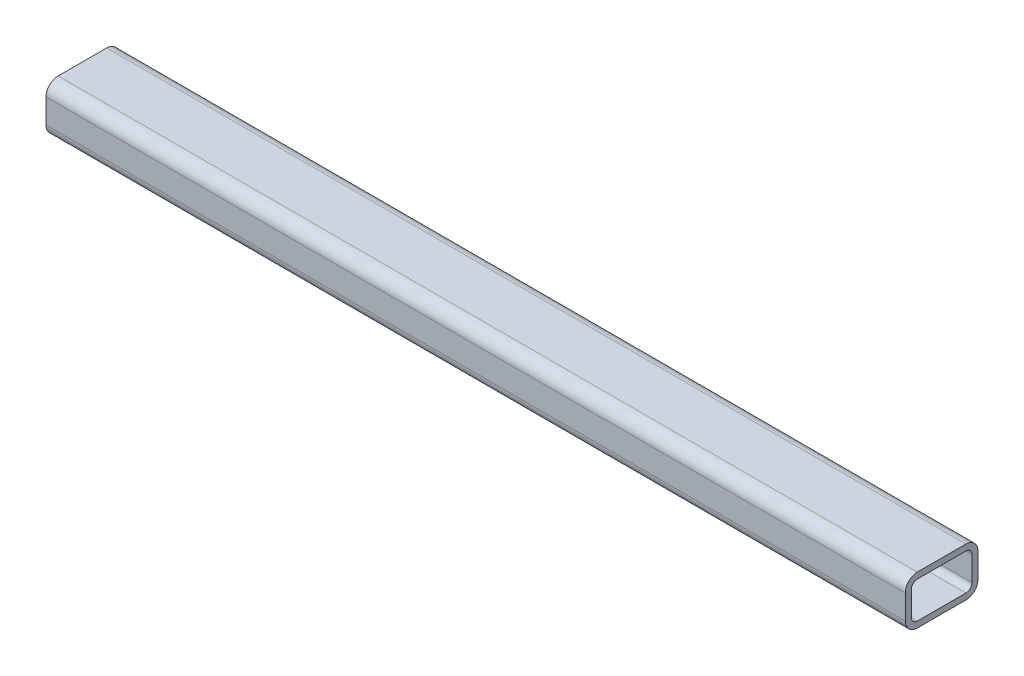
ISO-10303-21;
HEADER;
FILE_DESCRIPTION(('STEP AP214'),'2;1');
FILE_NAME('part.step','',(''),(''),'','','');
FILE_SCHEMA(('AUTOMOTIVE_DESIGN { 1 0 10303 214 1 1 1 1 }'));
ENDSEC;
DATA;
#1=APPLICATION_CONTEXT('core data for automotive mechanical design processes');
#2=APPLICATION_PROTOCOL_DEFINITION('international standard','automotive_design',2000,#1);
#3=PRODUCT_CONTEXT('',#1,'mechanical');
#4=PRODUCT('Part','Part','',(#3));
#5=PRODUCT_RELATED_PRODUCT_CATEGORY('part','',(#4));
#6=PRODUCT_DEFINITION_FORMATION('','',#4);
#7=PRODUCT_DEFINITION_CONTEXT('part definition',#1,'design');
#8=PRODUCT_DEFINITION('design','',#6,#7);
#9=PRODUCT_DEFINITION_SHAPE('','',#8);
#10=(LENGTH_UNIT() NAMED_UNIT(*) SI_UNIT(.MILLI.,.METRE.));
#11=(NAMED_UNIT(*) PLANE_ANGLE_UNIT() SI_UNIT($,.RADIAN.));
#12=(NAMED_UNIT(*) SI_UNIT($,.STERADIAN.) SOLID_ANGLE_UNIT());
#13=UNCERTAINTY_MEASURE_WITH_UNIT(LENGTH_MEASURE(1.E-05),#10,'distance_accuracy_value','');
#14=(GEOMETRIC_REPRESENTATION_CONTEXT(3) GLOBAL_UNCERTAINTY_ASSIGNED_CONTEXT((#13)) GLOBAL_UNIT_ASSIGNED_CONTEXT((#10,
#11,#12)) REPRESENTATION_CONTEXT('',''));
#15=CARTESIAN_POINT('',(0.,0.,0.));
#16=DIRECTION('',(0.,0.,1.));
#17=DIRECTION('',(1.,0.,0.));
#18=AXIS2_PLACEMENT_3D('',#15,#16,#17);
#19=CARTESIAN_POINT('',(900.,12.699978,25.4));
#20=DIRECTION('',(-1.,0.,0.));
#21=DIRECTION('',(0.,0.,1.));
#22=AXIS2_PLACEMENT_3D('',#19,#20,#21);
#23=CYLINDRICAL_SURFACE('',#22,12.7);
#24=CARTESIAN_POINT('',(0.,12.699978,25.4));
#25=DIRECTION('',(1.,0.,0.));
#26=DIRECTION('',(0.,0.,-1.));
#27=AXIS2_PLACEMENT_3D('',#24,#25,#26);
#28=CIRCLE('',#27,12.7);
#29=CARTESIAN_POINT('',(0.,25.399978,25.4));
#30=VERTEX_POINT('',#29);
#31=CARTESIAN_POINT('',(0.,12.699978,38.1));
#32=VERTEX_POINT('',#31);
#33=EDGE_CURVE('E239',#30,#32,#28,.T.);
#34=ORIENTED_EDGE('',*,*,#33,.T.);
#35=DIRECTION('',(-1.,0.,0.));
#36=VECTOR('',#35,1.);
#37=CARTESIAN_POINT('',(900.,12.699978,38.1));
#38=LINE('',#37,#36);
#39=CARTESIAN_POINT('',(900.,12.699978,38.1));
#40=VERTEX_POINT('',#39);
#41=EDGE_CURVE('E12',#40,#32,#38,.T.);
#42=ORIENTED_EDGE('',*,*,#41,.F.);
#43=CARTESIAN_POINT('',(900.,12.699978,25.4));
#44=DIRECTION('',(1.,0.,0.));
#45=DIRECTION('',(0.,0.,-1.));
#46=AXIS2_PLACEMENT_3D('',#43,#44,#45);
#47=CIRCLE('',#46,12.7);
#48=CARTESIAN_POINT('',(900.,25.399978,25.4));
#49=VERTEX_POINT('',#48);
#50=EDGE_CURVE('E317',#49,#40,#47,.T.);
#51=ORIENTED_EDGE('',*,*,#50,.F.);
#52=DIRECTION('',(-1.,0.,0.));
#53=VECTOR('',#52,1.);
#54=CARTESIAN_POINT('',(900.,25.399978,25.4));
#55=LINE('',#54,#53);
#56=EDGE_CURVE('E254',#49,#30,#55,.T.);
#57=ORIENTED_EDGE('',*,*,#56,.T.);
#58=EDGE_LOOP('',(#34,#42,#51,#57));
#59=FACE_BOUND('',#58,.T.);
#60=ADVANCED_FACE('F67',(#59),#23,.T.);
#61=CARTESIAN_POINT('',(900.,12.699978,38.1));
#62=DIRECTION('',(0.,0.,-1.));
#63=DIRECTION('',(-1.,0.,0.));
#64=AXIS2_PLACEMENT_3D('',#61,#62,#63);
#65=PLANE('',#64);
#66=DIRECTION('',(0.,-1.,0.));
#67=VECTOR('',#66,1.);
#68=CARTESIAN_POINT('',(0.,12.699978,38.1));
#69=LINE('',#68,#67);
#70=CARTESIAN_POINT('',(0.,-12.699978,38.1));
#71=VERTEX_POINT('',#70);
#72=EDGE_CURVE('E242',#32,#71,#69,.T.);
#73=ORIENTED_EDGE('',*,*,#72,.T.);
#74=DIRECTION('',(-1.,0.,0.));
#75=VECTOR('',#74,1.);
#76=CARTESIAN_POINT('',(900.,-12.699978,38.1));
#77=LINE('',#76,#75);
#78=CARTESIAN_POINT('',(900.,-12.699978,38.1));
#79=VERTEX_POINT('',#78);
#80=EDGE_CURVE('E77',#79,#71,#77,.T.);
#81=ORIENTED_EDGE('',*,*,#80,.F.);
#82=DIRECTION('',(0.,-1.,0.));
#83=VECTOR('',#82,1.);
#84=CARTESIAN_POINT('',(900.,12.699978,38.1));
#85=LINE('',#84,#83);
#86=EDGE_CURVE('E319',#40,#79,#85,.T.);
#87=ORIENTED_EDGE('',*,*,#86,.F.);
#88=ORIENTED_EDGE('',*,*,#41,.T.);
#89=EDGE_LOOP('',(#73,#81,#87,#88));
#90=FACE_BOUND('',#89,.T.);
#91=ADVANCED_FACE('F354',(#90),#65,.F.);
#92=CARTESIAN_POINT('',(900.,-12.699978,25.4));
#93=DIRECTION('',(-1.,0.,0.));
#94=DIRECTION('',(0.,0.,1.));
#95=AXIS2_PLACEMENT_3D('',#92,#93,#94);
#96=CYLINDRICAL_SURFACE('',#95,12.7);
#97=CARTESIAN_POINT('',(0.,-12.699978,25.4));
#98=DIRECTION('',(1.,0.,0.));
#99=DIRECTION('',(0.,0.,-1.));
#100=AXIS2_PLACEMENT_3D('',#97,#98,#99);
#101=CIRCLE('',#100,12.7);
#102=CARTESIAN_POINT('',(0.,-25.399978,25.4));
#103=VERTEX_POINT('',#102);
#104=EDGE_CURVE('E244',#71,#103,#101,.T.);
#105=ORIENTED_EDGE('',*,*,#104,.T.);
#106=DIRECTION('',(-1.,0.,0.));
#107=VECTOR('',#106,1.);
#108=CARTESIAN_POINT('',(900.,-25.399978,25.4));
#109=LINE('',#108,#107);
#110=CARTESIAN_POINT('',(900.,-25.399978,25.4));
#111=VERTEX_POINT('',#110);
#112=EDGE_CURVE('E261',#111,#103,#109,.T.);
#113=ORIENTED_EDGE('',*,*,#112,.F.);
#114=CARTESIAN_POINT('',(900.,-12.699978,25.4));
#115=DIRECTION('',(1.,0.,0.));
#116=DIRECTION('',(0.,0.,-1.));
#117=AXIS2_PLACEMENT_3D('',#114,#115,#116);
#118=CIRCLE('',#117,12.7);
#119=EDGE_CURVE('E321',#79,#111,#118,.T.);
#120=ORIENTED_EDGE('',*,*,#119,.F.);
#121=ORIENTED_EDGE('',*,*,#80,.T.);
#122=EDGE_LOOP('',(#105,#113,#120,#121));
#123=FACE_BOUND('',#122,.T.);
#124=ADVANCED_FACE('F359',(#123),#96,.T.);
#125=CARTESIAN_POINT('',(900.,-25.399978,-25.4));
#126=DIRECTION('',(0.,1.,0.));
#127=DIRECTION('',(0.,0.,1.));
#128=AXIS2_PLACEMENT_3D('',#125,#126,#127);
#129=PLANE('',#128);
#130=DIRECTION('',(0.,0.,-1.));
#131=VECTOR('',#130,1.);
#132=CARTESIAN_POINT('',(0.,-25.399978,-25.4));
#133=LINE('',#132,#131);
#134=CARTESIAN_POINT('',(0.,-25.399978,-25.4));
#135=VERTEX_POINT('',#134);
#136=EDGE_CURVE('E246',#103,#135,#133,.T.);
#137=ORIENTED_EDGE('',*,*,#136,.T.);
#138=DIRECTION('',(-1.,0.,0.));
#139=VECTOR('',#138,1.);
#140=CARTESIAN_POINT('',(900.,-25.399978,-25.4));
#141=LINE('',#140,#139);
#142=CARTESIAN_POINT('',(900.,-25.399978,-25.4));
#143=VERTEX_POINT('',#142);
#144=EDGE_CURVE('E258',#143,#135,#141,.T.);
#145=ORIENTED_EDGE('',*,*,#144,.F.);
#146=DIRECTION('',(0.,0.,-1.));
#147=VECTOR('',#146,1.);
#148=CARTESIAN_POINT('',(900.,-25.399978,-25.4));
#149=LINE('',#148,#147);
#150=EDGE_CURVE('E323',#111,#143,#149,.T.);
#151=ORIENTED_EDGE('',*,*,#150,.F.);
#152=ORIENTED_EDGE('',*,*,#112,.T.);
#153=EDGE_LOOP('',(#137,#145,#151,#152));
#154=FACE_BOUND('',#153,.T.);
#155=ADVANCED_FACE('F329',(#154),#129,.F.);
#156=CARTESIAN_POINT('',(900.,-12.699978,-25.4));
#157=DIRECTION('',(-1.,0.,0.));
#158=DIRECTION('',(0.,0.,1.));
#159=AXIS2_PLACEMENT_3D('',#156,#157,#158);
#160=CYLINDRICAL_SURFACE('',#159,12.7);
#161=CARTESIAN_POINT('',(0.,-12.699978,-25.4));
#162=DIRECTION('',(1.,0.,0.));
#163=DIRECTION('',(0.,0.,-1.));
#164=AXIS2_PLACEMENT_3D('',#161,#162,#163);
#165=CIRCLE('',#164,12.7);
#166=CARTESIAN_POINT('',(0.,-12.699978,-38.1));
#167=VERTEX_POINT('',#166);
#168=EDGE_CURVE('E248',#135,#167,#165,.T.);
#169=ORIENTED_EDGE('',*,*,#168,.T.);
#170=DIRECTION('',(-1.,0.,0.));
#171=VECTOR('',#170,1.);
#172=CARTESIAN_POINT('',(900.,-12.699978,-38.1));
#173=LINE('',#172,#171);
#174=CARTESIAN_POINT('',(900.,-12.699978,-38.1));
#175=VERTEX_POINT('',#174);
#176=EDGE_CURVE('E206',#175,#167,#173,.T.);
#177=ORIENTED_EDGE('',*,*,#176,.F.);
#178=CARTESIAN_POINT('',(900.,-12.699978,-25.4));
#179=DIRECTION('',(1.,0.,0.));
#180=DIRECTION('',(0.,0.,-1.));
#181=AXIS2_PLACEMENT_3D('',#178,#179,#180);
#182=CIRCLE('',#181,12.7);
#183=EDGE_CURVE('E197',#143,#175,#182,.T.);
#184=ORIENTED_EDGE('',*,*,#183,.F.);
#185=ORIENTED_EDGE('',*,*,#144,.T.);
#186=EDGE_LOOP('',(#169,#177,#184,#185));
#187=FACE_BOUND('',#186,.T.);
#188=ADVANCED_FACE('F333',(#187),#160,.T.);
#189=CARTESIAN_POINT('',(900.,-12.699978,-38.1));
#190=DIRECTION('',(0.,0.,1.));
#191=DIRECTION('',(1.,0.,0.));
#192=AXIS2_PLACEMENT_3D('',#189,#190,#191);
#193=PLANE('',#192);
#194=DIRECTION('',(0.,1.,0.));
#195=VECTOR('',#194,1.);
#196=CARTESIAN_POINT('',(0.,-12.699978,-38.1));
#197=LINE('',#196,#195);
#198=CARTESIAN_POINT('',(0.,12.699978,-38.1));
#199=VERTEX_POINT('',#198);
#200=EDGE_CURVE('E205',#167,#199,#197,.T.);
#201=ORIENTED_EDGE('',*,*,#200,.T.);
#202=DIRECTION('',(-1.,0.,0.));
#203=VECTOR('',#202,1.);
#204=CARTESIAN_POINT('',(900.,12.699978,-38.1));
#205=LINE('',#204,#203);
#206=CARTESIAN_POINT('',(900.,12.699978,-38.1));
#207=VERTEX_POINT('',#206);
#208=EDGE_CURVE('E202',#207,#199,#205,.T.);
#209=ORIENTED_EDGE('',*,*,#208,.F.);
#210=DIRECTION('',(0.,1.,0.));
#211=VECTOR('',#210,1.);
#212=CARTESIAN_POINT('',(900.,-12.699978,-38.1));
#213=LINE('',#212,#211);
#214=EDGE_CURVE('E191',#175,#207,#213,.T.);
#215=ORIENTED_EDGE('',*,*,#214,.F.);
#216=ORIENTED_EDGE('',*,*,#176,.T.);
#217=EDGE_LOOP('',(#201,#209,#215,#216));
#218=FACE_BOUND('',#217,.T.);
#219=ADVANCED_FACE('F203',(#218),#193,.F.);
#220=CARTESIAN_POINT('',(900.,12.699978,-25.4));
#221=DIRECTION('',(-1.,0.,0.));
#222=DIRECTION('',(0.,0.,1.));
#223=AXIS2_PLACEMENT_3D('',#220,#221,#222);
#224=CYLINDRICAL_SURFACE('',#223,12.7);
#225=CARTESIAN_POINT('',(0.,12.699978,-25.4));
#226=DIRECTION('',(1.,0.,0.));
#227=DIRECTION('',(0.,0.,-1.));
#228=AXIS2_PLACEMENT_3D('',#225,#226,#227);
#229=CIRCLE('',#228,12.7);
#230=CARTESIAN_POINT('',(0.,25.399978,-25.4));
#231=VERTEX_POINT('',#230);
#232=EDGE_CURVE('E139',#199,#231,#229,.T.);
#233=ORIENTED_EDGE('',*,*,#232,.T.);
#234=DIRECTION('',(-1.,0.,0.));
#235=VECTOR('',#234,1.);
#236=CARTESIAN_POINT('',(900.,25.399978,-25.4));
#237=LINE('',#236,#235);
#238=CARTESIAN_POINT('',(900.,25.399978,-25.4));
#239=VERTEX_POINT('',#238);
#240=EDGE_CURVE('E207',#239,#231,#237,.T.);
#241=ORIENTED_EDGE('',*,*,#240,.F.);
#242=CARTESIAN_POINT('',(900.,12.699978,-25.4));
#243=DIRECTION('',(1.,0.,0.));
#244=DIRECTION('',(0.,0.,-1.));
#245=AXIS2_PLACEMENT_3D('',#242,#243,#244);
#246=CIRCLE('',#245,12.7);
#247=EDGE_CURVE('E195',#207,#239,#246,.T.);
#248=ORIENTED_EDGE('',*,*,#247,.F.);
#249=ORIENTED_EDGE('',*,*,#208,.T.);
#250=EDGE_LOOP('',(#233,#241,#248,#249));
#251=FACE_BOUND('',#250,.T.);
#252=ADVANCED_FACE('F209',(#251),#224,.T.);
#253=CARTESIAN_POINT('',(900.,-12.699978,25.4));
#254=DIRECTION('',(-1.,0.,0.));
#255=DIRECTION('',(0.,0.,1.));
#256=AXIS2_PLACEMENT_3D('',#253,#254,#255);
#257=CYLINDRICAL_SURFACE('',#256,6.35);
#258=CARTESIAN_POINT('',(0.,-12.699978,25.4));
#259=DIRECTION('',(1.,0.,0.));
#260=DIRECTION('',(0.,0.,-1.));
#261=AXIS2_PLACEMENT_3D('',#258,#259,#260);
#262=CIRCLE('',#261,6.35);
#263=CARTESIAN_POINT('',(0.,-12.699978,31.75));
#264=VERTEX_POINT('',#263);
#265=CARTESIAN_POINT('',(0.,-19.049978,25.4));
#266=VERTEX_POINT('',#265);
#267=EDGE_CURVE('E215',#264,#266,#262,.T.);
#268=ORIENTED_EDGE('',*,*,#267,.F.);
#269=DIRECTION('',(-1.,0.,0.));
#270=VECTOR('',#269,1.);
#271=CARTESIAN_POINT('',(900.,-12.699978,31.75));
#272=LINE('',#271,#270);
#273=CARTESIAN_POINT('',(900.,-12.699978,31.75));
#274=VERTEX_POINT('',#273);
#275=EDGE_CURVE('E71',#274,#264,#272,.T.);
#276=ORIENTED_EDGE('',*,*,#275,.F.);
#277=CARTESIAN_POINT('',(900.,-12.699978,25.4));
#278=DIRECTION('',(1.,0.,0.));
#279=DIRECTION('',(0.,0.,-1.));
#280=AXIS2_PLACEMENT_3D('',#277,#278,#279);
#281=CIRCLE('',#280,6.35);
#282=CARTESIAN_POINT('',(900.,-19.049978,25.4));
#283=VERTEX_POINT('',#282);
#284=EDGE_CURVE('E253',#274,#283,#281,.T.);
#285=ORIENTED_EDGE('',*,*,#284,.T.);
#286=DIRECTION('',(-1.,0.,0.));
#287=VECTOR('',#286,1.);
#288=CARTESIAN_POINT('',(900.,-19.049978,25.4));
#289=LINE('',#288,#287);
#290=EDGE_CURVE('E211',#283,#266,#289,.T.);
#291=ORIENTED_EDGE('',*,*,#290,.T.);
#292=EDGE_LOOP('',(#268,#276,#285,#291));
#293=FACE_BOUND('',#292,.T.);
#294=ADVANCED_FACE('F69',(#293),#257,.F.);
#295=CARTESIAN_POINT('',(900.,12.699978,31.75));
#296=DIRECTION('',(0.,0.,-1.));
#297=DIRECTION('',(-1.,0.,0.));
#298=AXIS2_PLACEMENT_3D('',#295,#296,#297);
#299=PLANE('',#298);
#300=DIRECTION('',(0.,-1.,0.));
#301=VECTOR('',#300,1.);
#302=CARTESIAN_POINT('',(0.,12.699978,31.75));
#303=LINE('',#302,#301);
#304=CARTESIAN_POINT('',(0.,12.699978,31.75));
#305=VERTEX_POINT('',#304);
#306=EDGE_CURVE('E218',#305,#264,#303,.T.);
#307=ORIENTED_EDGE('',*,*,#306,.F.);
#308=DIRECTION('',(-1.,0.,0.));
#309=VECTOR('',#308,1.);
#310=CARTESIAN_POINT('',(900.,12.699978,31.75));
#311=LINE('',#310,#309);
#312=CARTESIAN_POINT('',(900.,12.699978,31.75));
#313=VERTEX_POINT('',#312);
#314=EDGE_CURVE('E276',#313,#305,#311,.T.);
#315=ORIENTED_EDGE('',*,*,#314,.F.);
#316=DIRECTION('',(0.,-1.,0.));
#317=VECTOR('',#316,1.);
#318=CARTESIAN_POINT('',(900.,12.699978,31.75));
#319=LINE('',#318,#317);
#320=EDGE_CURVE('E285',#313,#274,#319,.T.);
#321=ORIENTED_EDGE('',*,*,#320,.T.);
#322=ORIENTED_EDGE('',*,*,#275,.T.);
#323=EDGE_LOOP('',(#307,#315,#321,#322));
#324=FACE_BOUND('',#323,.T.);
#325=ADVANCED_FACE('F283',(#324),#299,.T.);
#326=CARTESIAN_POINT('',(900.,12.699978,25.4));
#327=DIRECTION('',(-1.,0.,0.));
#328=DIRECTION('',(0.,0.,1.));
#329=AXIS2_PLACEMENT_3D('',#326,#327,#328);
#330=CYLINDRICAL_SURFACE('',#329,6.35);
#331=CARTESIAN_POINT('',(0.,12.699978,25.4));
#332=DIRECTION('',(1.,0.,0.));
#333=DIRECTION('',(0.,0.,-1.));
#334=AXIS2_PLACEMENT_3D('',#331,#332,#333);
#335=CIRCLE('',#334,6.35);
#336=CARTESIAN_POINT('',(0.,19.049978,25.4));
#337=VERTEX_POINT('',#336);
#338=EDGE_CURVE('E221',#337,#305,#335,.T.);
#339=ORIENTED_EDGE('',*,*,#338,.F.);
#340=DIRECTION('',(-1.,0.,0.));
#341=VECTOR('',#340,1.);
#342=CARTESIAN_POINT('',(900.,19.049978,25.4));
#343=LINE('',#342,#341);
#344=CARTESIAN_POINT('',(900.,19.049978,25.4));
#345=VERTEX_POINT('',#344);
#346=EDGE_CURVE('E275',#345,#337,#343,.T.);
#347=ORIENTED_EDGE('',*,*,#346,.F.);
#348=CARTESIAN_POINT('',(900.,12.699978,25.4));
#349=DIRECTION('',(1.,0.,0.));
#350=DIRECTION('',(0.,0.,-1.));
#351=AXIS2_PLACEMENT_3D('',#348,#349,#350);
#352=CIRCLE('',#351,6.35);
#353=EDGE_CURVE('E293',#345,#313,#352,.T.);
#354=ORIENTED_EDGE('',*,*,#353,.T.);
#355=ORIENTED_EDGE('',*,*,#314,.T.);
#356=EDGE_LOOP('',(#339,#347,#354,#355));
#357=FACE_BOUND('',#356,.T.);
#358=ADVANCED_FACE('F291',(#357),#330,.F.);
#359=CARTESIAN_POINT('',(900.,19.049978,25.4));
#360=DIRECTION('',(0.,-1.,0.));
#361=DIRECTION('',(0.,0.,-1.));
#362=AXIS2_PLACEMENT_3D('',#359,#360,#361);
#363=PLANE('',#362);
#364=DIRECTION('',(0.,0.,1.));
#365=VECTOR('',#364,1.);
#366=CARTESIAN_POINT('',(0.,19.049978,25.4));
#367=LINE('',#366,#365);
#368=CARTESIAN_POINT('',(0.,19.049978,-25.4));
#369=VERTEX_POINT('',#368);
#370=EDGE_CURVE('E224',#369,#337,#367,.T.);
#371=ORIENTED_EDGE('',*,*,#370,.F.);
#372=DIRECTION('',(-1.,0.,0.));
#373=VECTOR('',#372,1.);
#374=CARTESIAN_POINT('',(900.,19.049978,-25.4));
#375=LINE('',#374,#373);
#376=CARTESIAN_POINT('',(900.,19.049978,-25.4));
#377=VERTEX_POINT('',#376);
#378=EDGE_CURVE('E273',#377,#369,#375,.T.);
#379=ORIENTED_EDGE('',*,*,#378,.F.);
#380=DIRECTION('',(0.,0.,1.));
#381=VECTOR('',#380,1.);
#382=CARTESIAN_POINT('',(900.,19.049978,25.4));
#383=LINE('',#382,#381);
#384=EDGE_CURVE('E299',#377,#345,#383,.T.);
#385=ORIENTED_EDGE('',*,*,#384,.T.);
#386=ORIENTED_EDGE('',*,*,#346,.T.);
#387=EDGE_LOOP('',(#371,#379,#385,#386));
#388=FACE_BOUND('',#387,.T.);
#389=ADVANCED_FACE('F302',(#388),#363,.T.);
#390=CARTESIAN_POINT('',(900.,12.699978,-25.4));
#391=DIRECTION('',(-1.,0.,0.));
#392=DIRECTION('',(0.,0.,1.));
#393=AXIS2_PLACEMENT_3D('',#390,#391,#392);
#394=CYLINDRICAL_SURFACE('',#393,6.35);
#395=CARTESIAN_POINT('',(0.,12.699978,-25.4));
#396=DIRECTION('',(1.,0.,0.));
#397=DIRECTION('',(0.,0.,-1.));
#398=AXIS2_PLACEMENT_3D('',#395,#396,#397);
#399=CIRCLE('',#398,6.35);
#400=CARTESIAN_POINT('',(0.,12.699978,-31.75));
#401=VERTEX_POINT('',#400);
#402=EDGE_CURVE('E227',#401,#369,#399,.T.);
#403=ORIENTED_EDGE('',*,*,#402,.F.);
#404=DIRECTION('',(-1.,0.,0.));
#405=VECTOR('',#404,1.);
#406=CARTESIAN_POINT('',(900.,12.699978,-31.75));
#407=LINE('',#406,#405);
#408=CARTESIAN_POINT('',(900.,12.699978,-31.75));
#409=VERTEX_POINT('',#408);
#410=EDGE_CURVE('E271',#409,#401,#407,.T.);
#411=ORIENTED_EDGE('',*,*,#410,.F.);
#412=CARTESIAN_POINT('',(900.,12.699978,-25.4));
#413=DIRECTION('',(1.,0.,0.));
#414=DIRECTION('',(0.,0.,-1.));
#415=AXIS2_PLACEMENT_3D('',#412,#413,#414);
#416=CIRCLE('',#415,6.35);
#417=EDGE_CURVE('E303',#409,#377,#416,.T.);
#418=ORIENTED_EDGE('',*,*,#417,.T.);
#419=ORIENTED_EDGE('',*,*,#378,.T.);
#420=EDGE_LOOP('',(#403,#411,#418,#419));
#421=FACE_BOUND('',#420,.T.);
#422=ADVANCED_FACE('F370',(#421),#394,.F.);
#423=CARTESIAN_POINT('',(900.,-12.699978,-31.75));
#424=DIRECTION('',(0.,0.,1.));
#425=DIRECTION('',(1.,0.,0.));
#426=AXIS2_PLACEMENT_3D('',#423,#424,#425);
#427=PLANE('',#426);
#428=DIRECTION('',(0.,1.,0.));
#429=VECTOR('',#428,1.);
#430=CARTESIAN_POINT('',(0.,-12.699978,-31.75));
#431=LINE('',#430,#429);
#432=CARTESIAN_POINT('',(0.,-12.699978,-31.75));
#433=VERTEX_POINT('',#432);
#434=EDGE_CURVE('E230',#433,#401,#431,.T.);
#435=ORIENTED_EDGE('',*,*,#434,.F.);
#436=DIRECTION('',(-1.,0.,0.));
#437=VECTOR('',#436,1.);
#438=CARTESIAN_POINT('',(900.,-12.699978,-31.75));
#439=LINE('',#438,#437);
#440=CARTESIAN_POINT('',(900.,-12.699978,-31.75));
#441=VERTEX_POINT('',#440);
#442=EDGE_CURVE('E269',#441,#433,#439,.T.);
#443=ORIENTED_EDGE('',*,*,#442,.F.);
#444=DIRECTION('',(0.,1.,0.));
#445=VECTOR('',#444,1.);
#446=CARTESIAN_POINT('',(900.,-12.699978,-31.75));
#447=LINE('',#446,#445);
#448=EDGE_CURVE('E305',#441,#409,#447,.T.);
#449=ORIENTED_EDGE('',*,*,#448,.T.);
#450=ORIENTED_EDGE('',*,*,#410,.T.);
#451=EDGE_LOOP('',(#435,#443,#449,#450));
#452=FACE_BOUND('',#451,.T.);
#453=ADVANCED_FACE('F366',(#452),#427,.T.);
#454=CARTESIAN_POINT('',(900.,-12.699978,-25.4));
#455=DIRECTION('',(-1.,0.,0.));
#456=DIRECTION('',(0.,0.,1.));
#457=AXIS2_PLACEMENT_3D('',#454,#455,#456);
#458=CYLINDRICAL_SURFACE('',#457,6.35);
#459=CARTESIAN_POINT('',(0.,-12.699978,-25.4));
#460=DIRECTION('',(1.,0.,0.));
#461=DIRECTION('',(0.,0.,-1.));
#462=AXIS2_PLACEMENT_3D('',#459,#460,#461);
#463=CIRCLE('',#462,6.35);
#464=CARTESIAN_POINT('',(0.,-19.049978,-25.4));
#465=VERTEX_POINT('',#464);
#466=EDGE_CURVE('E233',#465,#433,#463,.T.);
#467=ORIENTED_EDGE('',*,*,#466,.F.);
#468=DIRECTION('',(-1.,0.,0.));
#469=VECTOR('',#468,1.);
#470=CARTESIAN_POINT('',(900.,-19.049978,-25.4));
#471=LINE('',#470,#469);
#472=CARTESIAN_POINT('',(900.,-19.049978,-25.4));
#473=VERTEX_POINT('',#472);
#474=EDGE_CURVE('E267',#473,#465,#471,.T.);
#475=ORIENTED_EDGE('',*,*,#474,.F.);
#476=CARTESIAN_POINT('',(900.,-12.699978,-25.4));
#477=DIRECTION('',(1.,0.,0.));
#478=DIRECTION('',(0.,0.,-1.));
#479=AXIS2_PLACEMENT_3D('',#476,#477,#478);
#480=CIRCLE('',#479,6.35);
#481=EDGE_CURVE('E311',#473,#441,#480,.T.);
#482=ORIENTED_EDGE('',*,*,#481,.T.);
#483=ORIENTED_EDGE('',*,*,#442,.T.);
#484=EDGE_LOOP('',(#467,#475,#482,#483));
#485=FACE_BOUND('',#484,.T.);
#486=ADVANCED_FACE('F348',(#485),#458,.F.);
#487=CARTESIAN_POINT('',(900.,-19.049978,-25.4));
#488=DIRECTION('',(0.,1.,0.));
#489=DIRECTION('',(0.,0.,1.));
#490=AXIS2_PLACEMENT_3D('',#487,#488,#489);
#491=PLANE('',#490);
#492=DIRECTION('',(0.,0.,-1.));
#493=VECTOR('',#492,1.);
#494=CARTESIAN_POINT('',(0.,-19.049978,-25.4));
#495=LINE('',#494,#493);
#496=EDGE_CURVE('E236',#266,#465,#495,.T.);
#497=ORIENTED_EDGE('',*,*,#496,.F.);
#498=ORIENTED_EDGE('',*,*,#290,.F.);
#499=DIRECTION('',(0.,0.,-1.));
#500=VECTOR('',#499,1.);
#501=CARTESIAN_POINT('',(900.,-19.049978,-25.4));
#502=LINE('',#501,#500);
#503=EDGE_CURVE('E314',#283,#473,#502,.T.);
#504=ORIENTED_EDGE('',*,*,#503,.T.);
#505=ORIENTED_EDGE('',*,*,#474,.T.);
#506=EDGE_LOOP('',(#497,#498,#504,#505));
#507=FACE_BOUND('',#506,.T.);
#508=ADVANCED_FACE('F341',(#507),#491,.T.);
#509=CARTESIAN_POINT('',(900.,25.399978,25.4));
#510=DIRECTION('',(0.,-1.,0.));
#511=DIRECTION('',(0.,0.,-1.));
#512=AXIS2_PLACEMENT_3D('',#509,#510,#511);
#513=PLANE('',#512);
#514=DIRECTION('',(0.,0.,1.));
#515=VECTOR('',#514,1.);
#516=CARTESIAN_POINT('',(0.,25.399978,25.4));
#517=LINE('',#516,#515);
#518=EDGE_CURVE('E145',#231,#30,#517,.T.);
#519=ORIENTED_EDGE('',*,*,#518,.T.);
#520=ORIENTED_EDGE('',*,*,#56,.F.);
#521=DIRECTION('',(0.,0.,1.));
#522=VECTOR('',#521,1.);
#523=CARTESIAN_POINT('',(900.,25.399978,25.4));
#524=LINE('',#523,#522);
#525=EDGE_CURVE('E86',#239,#49,#524,.T.);
#526=ORIENTED_EDGE('',*,*,#525,.F.);
#527=ORIENTED_EDGE('',*,*,#240,.T.);
#528=EDGE_LOOP('',(#519,#520,#526,#527));
#529=FACE_BOUND('',#528,.T.);
#530=ADVANCED_FACE('F339',(#529),#513,.F.);
#531=CARTESIAN_POINT('',(900.,12.699978,25.4));
#532=DIRECTION('',(1.,0.,0.));
#533=DIRECTION('',(0.,0.,-1.));
#534=AXIS2_PLACEMENT_3D('',#531,#532,#533);
#535=PLANE('',#534);
#536=ORIENTED_EDGE('',*,*,#284,.F.);
#537=ORIENTED_EDGE('',*,*,#320,.F.);
#538=ORIENTED_EDGE('',*,*,#353,.F.);
#539=ORIENTED_EDGE('',*,*,#384,.F.);
#540=ORIENTED_EDGE('',*,*,#417,.F.);
#541=ORIENTED_EDGE('',*,*,#448,.F.);
#542=ORIENTED_EDGE('',*,*,#481,.F.);
#543=ORIENTED_EDGE('',*,*,#503,.F.);
#544=EDGE_LOOP('',(#536,#537,#538,#539,#540,#541,#542,#543));
#545=FACE_BOUND('',#544,.T.);
#546=ORIENTED_EDGE('',*,*,#50,.T.);
#547=ORIENTED_EDGE('',*,*,#86,.T.);
#548=ORIENTED_EDGE('',*,*,#119,.T.);
#549=ORIENTED_EDGE('',*,*,#150,.T.);
#550=ORIENTED_EDGE('',*,*,#183,.T.);
#551=ORIENTED_EDGE('',*,*,#214,.T.);
#552=ORIENTED_EDGE('',*,*,#247,.T.);
#553=ORIENTED_EDGE('',*,*,#525,.T.);
#554=EDGE_LOOP('',(#546,#547,#548,#549,#550,#551,#552,#553));
#555=FACE_BOUND('',#554,.T.);
#556=ADVANCED_FACE('F193',(#545,#555),#535,.T.);
#557=CARTESIAN_POINT('',(0.,12.699978,25.4));
#558=DIRECTION('',(1.,0.,0.));
#559=DIRECTION('',(0.,0.,-1.));
#560=AXIS2_PLACEMENT_3D('',#557,#558,#559);
#561=PLANE('',#560);
#562=ORIENTED_EDGE('',*,*,#267,.T.);
#563=ORIENTED_EDGE('',*,*,#496,.T.);
#564=ORIENTED_EDGE('',*,*,#466,.T.);
#565=ORIENTED_EDGE('',*,*,#434,.T.);
#566=ORIENTED_EDGE('',*,*,#402,.T.);
#567=ORIENTED_EDGE('',*,*,#370,.T.);
#568=ORIENTED_EDGE('',*,*,#338,.T.);
#569=ORIENTED_EDGE('',*,*,#306,.T.);
#570=EDGE_LOOP('',(#562,#563,#564,#565,#566,#567,#568,#569));
#571=FACE_BOUND('',#570,.T.);
#572=ORIENTED_EDGE('',*,*,#33,.F.);
#573=ORIENTED_EDGE('',*,*,#518,.F.);
#574=ORIENTED_EDGE('',*,*,#232,.F.);
#575=ORIENTED_EDGE('',*,*,#200,.F.);
#576=ORIENTED_EDGE('',*,*,#168,.F.);
#577=ORIENTED_EDGE('',*,*,#136,.F.);
#578=ORIENTED_EDGE('',*,*,#104,.F.);
#579=ORIENTED_EDGE('',*,*,#72,.F.);
#580=EDGE_LOOP('',(#572,#573,#574,#575,#576,#577,#578,#579));
#581=FACE_BOUND('',#580,.T.);
#582=ADVANCED_FACE('F288',(#571,#581),#561,.F.);
#583=CLOSED_SHELL('',(#60,#91,#124,#155,#188,#219,#252,#294,#325,#358,#389,#422,#453,#486,#508,
#530,#556,#582));
#584=MANIFOLD_SOLID_BREP('B2',#583);
#585=ADVANCED_BREP_SHAPE_REPRESENTATION('',(#18,#584),#14);
#586=SHAPE_DEFINITION_REPRESENTATION(#9,#585);
ENDSEC;
END-ISO-10303-21;
